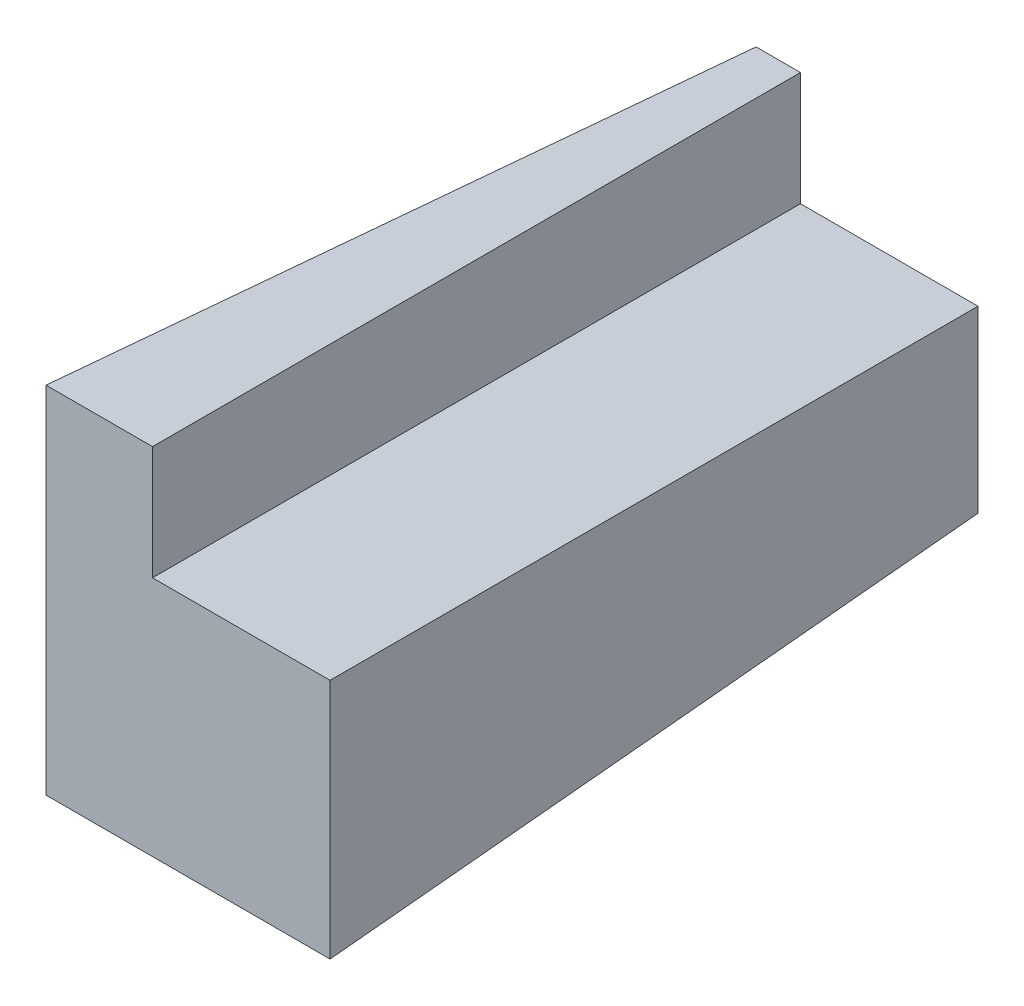
ISO-10303-21;
HEADER;
FILE_DESCRIPTION(('STEP AP214'),'2;1');
FILE_NAME('part.step','',(''),(''),'','','');
FILE_SCHEMA(('AUTOMOTIVE_DESIGN { 1 0 10303 214 1 1 1 1 }'));
ENDSEC;
DATA;
#1=APPLICATION_CONTEXT('core data for automotive mechanical design processes');
#2=APPLICATION_PROTOCOL_DEFINITION('international standard','automotive_design',2000,#1);
#3=PRODUCT_CONTEXT('',#1,'mechanical');
#4=PRODUCT('Part','Part','',(#3));
#5=PRODUCT_RELATED_PRODUCT_CATEGORY('part','',(#4));
#6=PRODUCT_DEFINITION_FORMATION('','',#4);
#7=PRODUCT_DEFINITION_CONTEXT('part definition',#1,'design');
#8=PRODUCT_DEFINITION('design','',#6,#7);
#9=PRODUCT_DEFINITION_SHAPE('','',#8);
#10=(LENGTH_UNIT() NAMED_UNIT(*) SI_UNIT(.MILLI.,.METRE.));
#11=(NAMED_UNIT(*) PLANE_ANGLE_UNIT() SI_UNIT($,.RADIAN.));
#12=(NAMED_UNIT(*) SI_UNIT($,.STERADIAN.) SOLID_ANGLE_UNIT());
#13=UNCERTAINTY_MEASURE_WITH_UNIT(LENGTH_MEASURE(1.E-05),#10,'distance_accuracy_value','');
#14=(GEOMETRIC_REPRESENTATION_CONTEXT(3) GLOBAL_UNCERTAINTY_ASSIGNED_CONTEXT((#13)) GLOBAL_UNIT_ASSIGNED_CONTEXT((#10,
#11,#12)) REPRESENTATION_CONTEXT('',''));
#15=CARTESIAN_POINT('',(0.,0.,0.));
#16=DIRECTION('',(0.,0.,1.));
#17=DIRECTION('',(1.,0.,0.));
#18=AXIS2_PLACEMENT_3D('',#15,#16,#17);
#19=CARTESIAN_POINT('',(8.,0.,50.));
#20=DIRECTION('',(0.,1.,0.));
#21=DIRECTION('',(0.,0.,1.));
#22=AXIS2_PLACEMENT_3D('',#19,#20,#21);
#23=PLANE('',#22);
#24=DIRECTION('',(-1.,0.,0.));
#25=VECTOR('',#24,1.);
#26=CARTESIAN_POINT('',(0.,0.,30.));
#27=LINE('',#26,#25);
#28=CARTESIAN_POINT('',(6.25022672948152,0.,30.));
#29=VERTEX_POINT('',#28);
#30=CARTESIAN_POINT('',(0.,0.,30.));
#31=VERTEX_POINT('',#30);
#32=EDGE_CURVE('E62',#29,#31,#27,.T.);
#33=ORIENTED_EDGE('',*,*,#32,.F.);
#34=DIRECTION('',(0.0871557427476584,0.,0.996194698091746));
#35=VECTOR('',#34,1.);
#36=CARTESIAN_POINT('',(8.,0.,50.));
#37=LINE('',#36,#35);
#38=CARTESIAN_POINT('',(8.,0.,50.));
#39=VERTEX_POINT('',#38);
#40=EDGE_CURVE('E11',#39,#29,#37,.F.);
#41=ORIENTED_EDGE('',*,*,#40,.F.);
#42=DIRECTION('',(1.,0.,0.));
#43=VECTOR('',#42,1.);
#44=CARTESIAN_POINT('',(8.,0.,50.));
#45=LINE('',#44,#43);
#46=CARTESIAN_POINT('',(0.,0.,50.));
#47=VERTEX_POINT('',#46);
#48=EDGE_CURVE('E108',#47,#39,#45,.T.);
#49=ORIENTED_EDGE('',*,*,#48,.F.);
#50=DIRECTION('',(0.,0.,-1.));
#51=VECTOR('',#50,1.);
#52=CARTESIAN_POINT('',(0.,0.,50.));
#53=LINE('',#52,#51);
#54=EDGE_CURVE('E114',#47,#31,#53,.T.);
#55=ORIENTED_EDGE('',*,*,#54,.T.);
#56=EDGE_LOOP('',(#33,#41,#49,#55));
#57=FACE_BOUND('',#56,.T.);
#58=ADVANCED_FACE('F45',(#57),#23,.F.);
#59=CARTESIAN_POINT('',(8.,6.8,50.));
#60=DIRECTION('',(0.996194698091746,0.,-0.0871557427476584));
#61=DIRECTION('',(-0.0871557427476584,0.,-0.996194698091746));
#62=AXIS2_PLACEMENT_3D('',#59,#60,#61);
#63=PLANE('',#62);
#64=DIRECTION('',(0.,1.,0.));
#65=VECTOR('',#64,1.);
#66=CARTESIAN_POINT('',(6.25022672948152,6.8,30.));
#67=LINE('',#66,#65);
#68=CARTESIAN_POINT('',(6.25022672948152,5.05022672948152,30.));
#69=VERTEX_POINT('',#68);
#70=EDGE_CURVE('E100',#69,#29,#67,.F.);
#71=ORIENTED_EDGE('',*,*,#70,.F.);
#72=DIRECTION('',(-0.0868265938642478,-0.0868265938642478,-0.992432509138967));
#73=VECTOR('',#72,1.);
#74=CARTESIAN_POINT('',(7.96230571298967,6.76230571298967,49.5691523279566));
#75=LINE('',#74,#73);
#76=CARTESIAN_POINT('',(8.,6.8,50.));
#77=VERTEX_POINT('',#76);
#78=EDGE_CURVE('E55',#77,#69,#75,.T.);
#79=ORIENTED_EDGE('',*,*,#78,.F.);
#80=DIRECTION('',(0.,1.,0.));
#81=VECTOR('',#80,1.);
#82=CARTESIAN_POINT('',(8.,6.8,50.));
#83=LINE('',#82,#81);
#84=EDGE_CURVE('E120',#39,#77,#83,.T.);
#85=ORIENTED_EDGE('',*,*,#84,.F.);
#86=ORIENTED_EDGE('',*,*,#40,.T.);
#87=EDGE_LOOP('',(#71,#79,#85,#86));
#88=FACE_BOUND('',#87,.T.);
#89=ADVANCED_FACE('F119',(#88),#63,.T.);
#90=CARTESIAN_POINT('',(3.,6.8,50.));
#91=DIRECTION('',(0.,0.996194698091746,-0.0871557427476584));
#92=DIRECTION('',(0.,0.0871557427476584,0.996194698091746));
#93=AXIS2_PLACEMENT_3D('',#90,#91,#92);
#94=PLANE('',#93);
#95=DIRECTION('',(-1.,0.,0.));
#96=VECTOR('',#95,1.);
#97=CARTESIAN_POINT('',(3.,5.05022672948152,30.));
#98=LINE('',#97,#96);
#99=CARTESIAN_POINT('',(1.25022672948152,5.05022672948152,30.));
#100=VERTEX_POINT('',#99);
#101=EDGE_CURVE('E103',#100,#69,#98,.F.);
#102=ORIENTED_EDGE('',*,*,#101,.F.);
#103=DIRECTION('',(-0.0868265938642478,-0.0868265938642478,-0.992432509138967));
#104=VECTOR('',#103,1.);
#105=CARTESIAN_POINT('',(3.,6.8,50.));
#106=LINE('',#105,#104);
#107=CARTESIAN_POINT('',(3.,6.8,50.));
#108=VERTEX_POINT('',#107);
#109=EDGE_CURVE('E144',#108,#100,#106,.T.);
#110=ORIENTED_EDGE('',*,*,#109,.F.);
#111=DIRECTION('',(-1.,0.,0.));
#112=VECTOR('',#111,1.);
#113=CARTESIAN_POINT('',(3.,6.8,50.));
#114=LINE('',#113,#112);
#115=EDGE_CURVE('E123',#77,#108,#114,.T.);
#116=ORIENTED_EDGE('',*,*,#115,.F.);
#117=ORIENTED_EDGE('',*,*,#78,.T.);
#118=EDGE_LOOP('',(#102,#110,#116,#117));
#119=FACE_BOUND('',#118,.T.);
#120=ADVANCED_FACE('F173',(#119),#94,.T.);
#121=CARTESIAN_POINT('',(3.,10.,50.));
#122=DIRECTION('',(0.996194698091745,0.,-0.0871557427476584));
#123=DIRECTION('',(-0.0871557427476584,0.,-0.996194698091746));
#124=AXIS2_PLACEMENT_3D('',#121,#122,#123);
#125=PLANE('',#124);
#126=DIRECTION('',(0.,1.,0.));
#127=VECTOR('',#126,1.);
#128=CARTESIAN_POINT('',(1.25022672948152,10.,30.));
#129=LINE('',#128,#127);
#130=CARTESIAN_POINT('',(1.25022672948152,8.25022672948152,30.));
#131=VERTEX_POINT('',#130);
#132=EDGE_CURVE('E164',#131,#100,#129,.F.);
#133=ORIENTED_EDGE('',*,*,#132,.F.);
#134=DIRECTION('',(-0.0868265938642478,-0.0868265938642478,-0.992432509138967));
#135=VECTOR('',#134,1.);
#136=CARTESIAN_POINT('',(2.9773834277938,9.9773834277938,49.7414913967739));
#137=LINE('',#136,#135);
#138=CARTESIAN_POINT('',(3.,10.,50.));
#139=VERTEX_POINT('',#138);
#140=EDGE_CURVE('E148',#139,#131,#137,.T.);
#141=ORIENTED_EDGE('',*,*,#140,.F.);
#142=DIRECTION('',(0.,1.,0.));
#143=VECTOR('',#142,1.);
#144=CARTESIAN_POINT('',(3.,10.,50.));
#145=LINE('',#144,#143);
#146=EDGE_CURVE('E132',#108,#139,#145,.T.);
#147=ORIENTED_EDGE('',*,*,#146,.F.);
#148=ORIENTED_EDGE('',*,*,#109,.T.);
#149=EDGE_LOOP('',(#133,#141,#147,#148));
#150=FACE_BOUND('',#149,.T.);
#151=ADVANCED_FACE('F163',(#150),#125,.T.);
#152=CARTESIAN_POINT('',(0.,10.,50.));
#153=DIRECTION('',(0.,0.996194698091746,-0.0871557427476584));
#154=DIRECTION('',(0.,0.0871557427476584,0.996194698091746));
#155=AXIS2_PLACEMENT_3D('',#152,#153,#154);
#156=PLANE('',#155);
#157=DIRECTION('',(-1.,0.,0.));
#158=VECTOR('',#157,1.);
#159=CARTESIAN_POINT('',(0.,8.25022672948152,30.));
#160=LINE('',#159,#158);
#161=CARTESIAN_POINT('',(0.,8.25022672948152,30.));
#162=VERTEX_POINT('',#161);
#163=EDGE_CURVE('E116',#162,#131,#160,.F.);
#164=ORIENTED_EDGE('',*,*,#163,.F.);
#165=DIRECTION('',(0.,0.0871557427476584,0.996194698091746));
#166=VECTOR('',#165,1.);
#167=CARTESIAN_POINT('',(0.,9.92403876506104,49.1317591116653));
#168=LINE('',#167,#166);
#169=CARTESIAN_POINT('',(0.,10.,50.));
#170=VERTEX_POINT('',#169);
#171=EDGE_CURVE('E49',#170,#162,#168,.F.);
#172=ORIENTED_EDGE('',*,*,#171,.F.);
#173=DIRECTION('',(-1.,0.,0.));
#174=VECTOR('',#173,1.);
#175=CARTESIAN_POINT('',(0.,10.,50.));
#176=LINE('',#175,#174);
#177=EDGE_CURVE('E135',#139,#170,#176,.T.);
#178=ORIENTED_EDGE('',*,*,#177,.F.);
#179=ORIENTED_EDGE('',*,*,#140,.T.);
#180=EDGE_LOOP('',(#164,#172,#178,#179));
#181=FACE_BOUND('',#180,.T.);
#182=ADVANCED_FACE('F47',(#181),#156,.T.);
#183=CARTESIAN_POINT('',(0.,0.,50.));
#184=DIRECTION('',(1.,0.,0.));
#185=DIRECTION('',(0.,0.,-1.));
#186=AXIS2_PLACEMENT_3D('',#183,#184,#185);
#187=PLANE('',#186);
#188=DIRECTION('',(0.,1.,0.));
#189=VECTOR('',#188,1.);
#190=CARTESIAN_POINT('',(0.,0.,30.));
#191=LINE('',#190,#189);
#192=EDGE_CURVE('E117',#31,#162,#191,.T.);
#193=ORIENTED_EDGE('',*,*,#192,.F.);
#194=ORIENTED_EDGE('',*,*,#54,.F.);
#195=DIRECTION('',(0.,-1.,0.));
#196=VECTOR('',#195,1.);
#197=CARTESIAN_POINT('',(0.,0.,50.));
#198=LINE('',#197,#196);
#199=EDGE_CURVE('E70',#170,#47,#198,.T.);
#200=ORIENTED_EDGE('',*,*,#199,.F.);
#201=ORIENTED_EDGE('',*,*,#171,.T.);
#202=EDGE_LOOP('',(#193,#194,#200,#201));
#203=FACE_BOUND('',#202,.T.);
#204=ADVANCED_FACE('F158',(#203),#187,.F.);
#205=CARTESIAN_POINT('',(0.,0.,50.));
#206=DIRECTION('',(0.,0.,-1.));
#207=DIRECTION('',(-1.,0.,0.));
#208=AXIS2_PLACEMENT_3D('',#205,#206,#207);
#209=PLANE('',#208);
#210=ORIENTED_EDGE('',*,*,#48,.T.);
#211=ORIENTED_EDGE('',*,*,#84,.T.);
#212=ORIENTED_EDGE('',*,*,#115,.T.);
#213=ORIENTED_EDGE('',*,*,#146,.T.);
#214=ORIENTED_EDGE('',*,*,#177,.T.);
#215=ORIENTED_EDGE('',*,*,#199,.T.);
#216=EDGE_LOOP('',(#210,#211,#212,#213,#214,#215));
#217=FACE_BOUND('',#216,.T.);
#218=ADVANCED_FACE('F125',(#217),#209,.F.);
#219=CARTESIAN_POINT('',(0.,0.,30.));
#220=DIRECTION('',(0.,0.,-1.));
#221=DIRECTION('',(-1.,0.,0.));
#222=AXIS2_PLACEMENT_3D('',#219,#220,#221);
#223=PLANE('',#222);
#224=ORIENTED_EDGE('',*,*,#70,.T.);
#225=ORIENTED_EDGE('',*,*,#32,.T.);
#226=ORIENTED_EDGE('',*,*,#192,.T.);
#227=ORIENTED_EDGE('',*,*,#163,.T.);
#228=ORIENTED_EDGE('',*,*,#132,.T.);
#229=ORIENTED_EDGE('',*,*,#101,.T.);
#230=EDGE_LOOP('',(#224,#225,#226,#227,#228,#229));
#231=FACE_BOUND('',#230,.T.);
#232=ADVANCED_FACE('F101',(#231),#223,.T.);
#233=CLOSED_SHELL('',(#58,#89,#120,#151,#182,#204,#218,#232));
#234=MANIFOLD_SOLID_BREP('B2',#233);
#235=ADVANCED_BREP_SHAPE_REPRESENTATION('',(#18,#234),#14);
#236=SHAPE_DEFINITION_REPRESENTATION(#9,#235);
ENDSEC;
END-ISO-10303-21;
